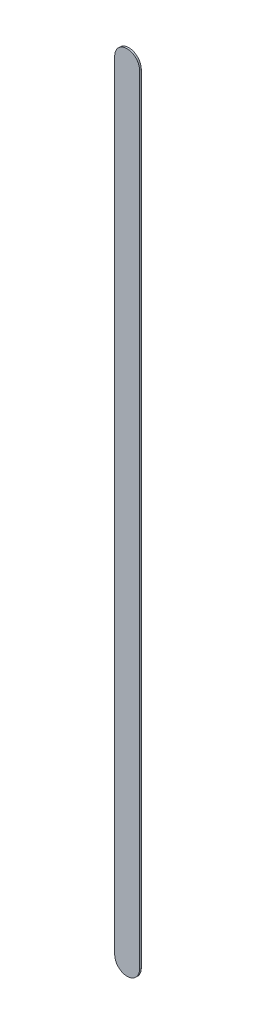
ISO-10303-21;
HEADER;
FILE_DESCRIPTION(('STEP AP214'),'2;1');
FILE_NAME('part.step','',(''),(''),'','','');
FILE_SCHEMA(('AUTOMOTIVE_DESIGN { 1 0 10303 214 1 1 1 1 }'));
ENDSEC;
DATA;
#1=APPLICATION_CONTEXT('core data for automotive mechanical design processes');
#2=APPLICATION_PROTOCOL_DEFINITION('international standard','automotive_design',2000,#1);
#3=PRODUCT_CONTEXT('',#1,'mechanical');
#4=PRODUCT('Part','Part','',(#3));
#5=PRODUCT_RELATED_PRODUCT_CATEGORY('part','',(#4));
#6=PRODUCT_DEFINITION_FORMATION('','',#4);
#7=PRODUCT_DEFINITION_CONTEXT('part definition',#1,'design');
#8=PRODUCT_DEFINITION('design','',#6,#7);
#9=PRODUCT_DEFINITION_SHAPE('','',#8);
#10=(LENGTH_UNIT() NAMED_UNIT(*) SI_UNIT(.MILLI.,.METRE.));
#11=(NAMED_UNIT(*) PLANE_ANGLE_UNIT() SI_UNIT($,.RADIAN.));
#12=(NAMED_UNIT(*) SI_UNIT($,.STERADIAN.) SOLID_ANGLE_UNIT());
#13=UNCERTAINTY_MEASURE_WITH_UNIT(LENGTH_MEASURE(1.E-05),#10,'distance_accuracy_value','');
#14=(GEOMETRIC_REPRESENTATION_CONTEXT(3) GLOBAL_UNCERTAINTY_ASSIGNED_CONTEXT((#13)) GLOBAL_UNIT_ASSIGNED_CONTEXT((#10,
#11,#12)) REPRESENTATION_CONTEXT('',''));
#15=CARTESIAN_POINT('',(0.,0.,0.));
#16=DIRECTION('',(0.,0.,1.));
#17=DIRECTION('',(1.,0.,0.));
#18=AXIS2_PLACEMENT_3D('',#15,#16,#17);
#19=CARTESIAN_POINT('',(48.64999922,77.00000094,0.));
#20=DIRECTION('',(-1.,0.,0.));
#21=DIRECTION('',(0.,1.,0.));
#22=AXIS2_PLACEMENT_3D('',#19,#20,#21);
#23=PLANE('',#22);
#24=DIRECTION('',(0.,1.,0.));
#25=VECTOR('',#24,1.);
#26=CARTESIAN_POINT('',(48.64999922,77.00000094,0.03556));
#27=LINE('',#26,#25);
#28=CARTESIAN_POINT('',(48.64999922,77.00000094,0.03556));
#29=VERTEX_POINT('',#28);
#30=CARTESIAN_POINT('',(48.64999922,92.683584,0.03556));
#31=VERTEX_POINT('',#30);
#32=EDGE_CURVE('E11',#29,#31,#27,.T.);
#33=ORIENTED_EDGE('',*,*,#32,.F.);
#34=DIRECTION('',(0.,0.,1.));
#35=VECTOR('',#34,1.);
#36=CARTESIAN_POINT('',(48.64999922,77.00000094,0.));
#37=LINE('',#36,#35);
#38=CARTESIAN_POINT('',(48.64999922,77.00000094,0.));
#39=VERTEX_POINT('',#38);
#40=EDGE_CURVE('E24',#39,#29,#37,.T.);
#41=ORIENTED_EDGE('',*,*,#40,.F.);
#42=DIRECTION('',(0.,1.,0.));
#43=VECTOR('',#42,1.);
#44=CARTESIAN_POINT('',(48.64999922,77.00000094,0.));
#45=LINE('',#44,#43);
#46=CARTESIAN_POINT('',(48.64999922,92.683584,0.));
#47=VERTEX_POINT('',#46);
#48=EDGE_CURVE('E75',#39,#47,#45,.T.);
#49=ORIENTED_EDGE('',*,*,#48,.T.);
#50=DIRECTION('',(0.,0.,1.));
#51=VECTOR('',#50,1.);
#52=CARTESIAN_POINT('',(48.64999922,92.683584,0.));
#53=LINE('',#52,#51);
#54=EDGE_CURVE('E37',#47,#31,#53,.T.);
#55=ORIENTED_EDGE('',*,*,#54,.T.);
#56=EDGE_LOOP('',(#33,#41,#49,#55));
#57=FACE_BOUND('',#56,.T.);
#58=ADVANCED_FACE('F17',(#57),#23,.F.);
#59=CARTESIAN_POINT('',(48.39999972,92.683584,0.));
#60=DIRECTION('',(0.,0.,-1.));
#61=DIRECTION('',(1.,0.,0.));
#62=AXIS2_PLACEMENT_3D('',#59,#60,#61);
#63=CYLINDRICAL_SURFACE('',#62,0.249999500000001);
#64=CARTESIAN_POINT('',(48.39999972,92.683584,0.03556));
#65=DIRECTION('',(0.,0.,1.));
#66=DIRECTION('',(1.,0.,0.));
#67=AXIS2_PLACEMENT_3D('',#64,#65,#66);
#68=CIRCLE('',#67,0.249999500000001);
#69=CARTESIAN_POINT('',(48.15000022,92.683584,0.03556));
#70=VERTEX_POINT('',#69);
#71=EDGE_CURVE('E83',#31,#70,#68,.T.);
#72=ORIENTED_EDGE('',*,*,#71,.F.);
#73=ORIENTED_EDGE('',*,*,#54,.F.);
#74=CARTESIAN_POINT('',(48.39999972,92.683584,0.));
#75=DIRECTION('',(0.,0.,1.));
#76=DIRECTION('',(1.,0.,0.));
#77=AXIS2_PLACEMENT_3D('',#74,#75,#76);
#78=CIRCLE('',#77,0.249999500000001);
#79=CARTESIAN_POINT('',(48.15000022,92.683584,0.));
#80=VERTEX_POINT('',#79);
#81=EDGE_CURVE('E81',#47,#80,#78,.T.);
#82=ORIENTED_EDGE('',*,*,#81,.T.);
#83=DIRECTION('',(0.,0.,1.));
#84=VECTOR('',#83,1.);
#85=CARTESIAN_POINT('',(48.15000022,92.683584,0.));
#86=LINE('',#85,#84);
#87=EDGE_CURVE('E67',#80,#70,#86,.T.);
#88=ORIENTED_EDGE('',*,*,#87,.T.);
#89=EDGE_LOOP('',(#72,#73,#82,#88));
#90=FACE_BOUND('',#89,.T.);
#91=ADVANCED_FACE('F89',(#90),#63,.T.);
#92=CARTESIAN_POINT('',(48.15000022,92.683584,0.));
#93=DIRECTION('',(1.,0.,0.));
#94=DIRECTION('',(0.,-1.,0.));
#95=AXIS2_PLACEMENT_3D('',#92,#93,#94);
#96=PLANE('',#95);
#97=DIRECTION('',(0.,-1.,0.));
#98=VECTOR('',#97,1.);
#99=CARTESIAN_POINT('',(48.15000022,92.683584,0.03556));
#100=LINE('',#99,#98);
#101=CARTESIAN_POINT('',(48.15000022,77.00000094,0.03556));
#102=VERTEX_POINT('',#101);
#103=EDGE_CURVE('E71',#70,#102,#100,.T.);
#104=ORIENTED_EDGE('',*,*,#103,.F.);
#105=ORIENTED_EDGE('',*,*,#87,.F.);
#106=DIRECTION('',(0.,-1.,0.));
#107=VECTOR('',#106,1.);
#108=CARTESIAN_POINT('',(48.15000022,92.683584,0.));
#109=LINE('',#108,#107);
#110=CARTESIAN_POINT('',(48.15000022,77.00000094,0.));
#111=VERTEX_POINT('',#110);
#112=EDGE_CURVE('E63',#80,#111,#109,.T.);
#113=ORIENTED_EDGE('',*,*,#112,.T.);
#114=DIRECTION('',(0.,0.,1.));
#115=VECTOR('',#114,1.);
#116=CARTESIAN_POINT('',(48.15000022,77.00000094,0.));
#117=LINE('',#116,#115);
#118=EDGE_CURVE('E53',#111,#102,#117,.T.);
#119=ORIENTED_EDGE('',*,*,#118,.T.);
#120=EDGE_LOOP('',(#104,#105,#113,#119));
#121=FACE_BOUND('',#120,.T.);
#122=ADVANCED_FACE('F66',(#121),#96,.F.);
#123=CARTESIAN_POINT('',(48.39999972,77.00000094,0.));
#124=DIRECTION('',(0.,0.,-1.));
#125=DIRECTION('',(-1.,-1.13687065095746E-13,0.));
#126=AXIS2_PLACEMENT_3D('',#123,#124,#125);
#127=CYLINDRICAL_SURFACE('',#126,0.249999500000006);
#128=CARTESIAN_POINT('',(48.39999972,77.00000094,0.03556));
#129=DIRECTION('',(0.,0.,1.));
#130=DIRECTION('',(-1.,-1.13687065095746E-13,0.));
#131=AXIS2_PLACEMENT_3D('',#128,#129,#130);
#132=CIRCLE('',#131,0.249999500000006);
#133=EDGE_CURVE('E59',#102,#29,#132,.T.);
#134=ORIENTED_EDGE('',*,*,#133,.F.);
#135=ORIENTED_EDGE('',*,*,#118,.F.);
#136=CARTESIAN_POINT('',(48.39999972,77.00000094,0.));
#137=DIRECTION('',(0.,0.,1.));
#138=DIRECTION('',(-1.,-1.13687065095746E-13,0.));
#139=AXIS2_PLACEMENT_3D('',#136,#137,#138);
#140=CIRCLE('',#139,0.249999500000006);
#141=EDGE_CURVE('E57',#111,#39,#140,.T.);
#142=ORIENTED_EDGE('',*,*,#141,.T.);
#143=ORIENTED_EDGE('',*,*,#40,.T.);
#144=EDGE_LOOP('',(#134,#135,#142,#143));
#145=FACE_BOUND('',#144,.T.);
#146=ADVANCED_FACE('F55',(#145),#127,.T.);
#147=CARTESIAN_POINT('',(48.64999922,77.00000094,0.));
#148=DIRECTION('',(0.,0.,-1.));
#149=DIRECTION('',(-1.,0.,0.));
#150=AXIS2_PLACEMENT_3D('',#147,#148,#149);
#151=PLANE('',#150);
#152=ORIENTED_EDGE('',*,*,#141,.F.);
#153=ORIENTED_EDGE('',*,*,#112,.F.);
#154=ORIENTED_EDGE('',*,*,#81,.F.);
#155=ORIENTED_EDGE('',*,*,#48,.F.);
#156=EDGE_LOOP('',(#152,#153,#154,#155));
#157=FACE_BOUND('',#156,.T.);
#158=ADVANCED_FACE('F74',(#157),#151,.T.);
#159=CARTESIAN_POINT('',(48.64999922,77.00000094,0.03556));
#160=DIRECTION('',(0.,0.,-1.));
#161=DIRECTION('',(-1.,0.,0.));
#162=AXIS2_PLACEMENT_3D('',#159,#160,#161);
#163=PLANE('',#162);
#164=ORIENTED_EDGE('',*,*,#32,.T.);
#165=ORIENTED_EDGE('',*,*,#71,.T.);
#166=ORIENTED_EDGE('',*,*,#103,.T.);
#167=ORIENTED_EDGE('',*,*,#133,.T.);
#168=EDGE_LOOP('',(#164,#165,#166,#167));
#169=FACE_BOUND('',#168,.T.);
#170=ADVANCED_FACE('F91',(#169),#163,.F.);
#171=CLOSED_SHELL('',(#58,#91,#122,#146,#158,#170));
#172=MANIFOLD_SOLID_BREP('B1',#171);
#173=ADVANCED_BREP_SHAPE_REPRESENTATION('',(#18,#172),#14);
#174=SHAPE_DEFINITION_REPRESENTATION(#9,#173);
ENDSEC;
END-ISO-10303-21;
